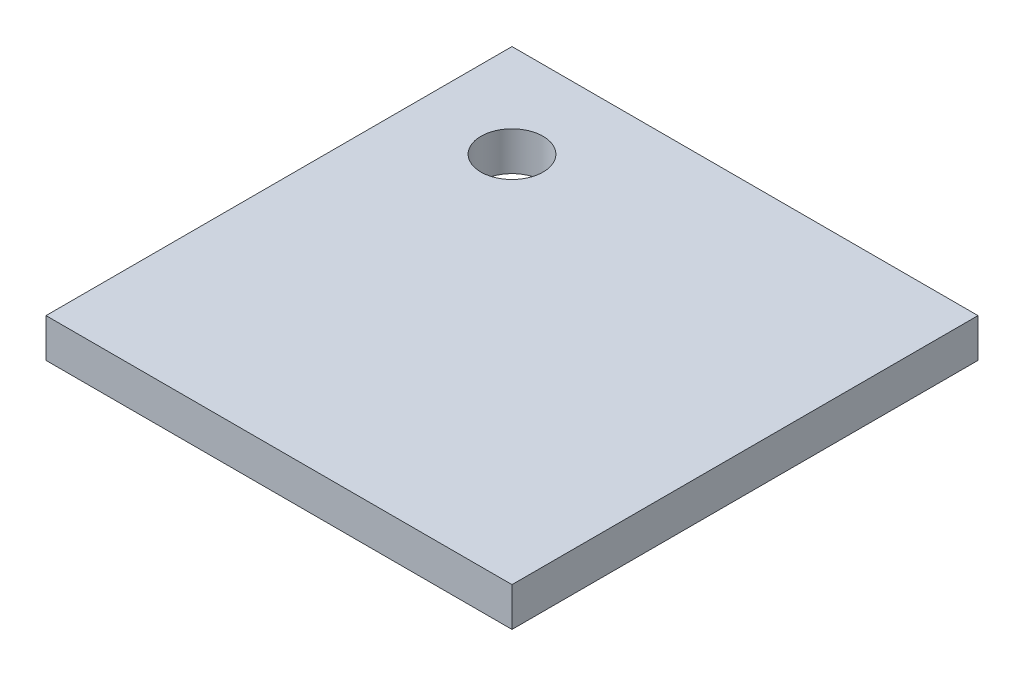
ISO-10303-21;
HEADER;
FILE_DESCRIPTION(('STEP AP214'),'2;1');
FILE_NAME('part.step','',(''),(''),'','','');
FILE_SCHEMA(('AUTOMOTIVE_DESIGN { 1 0 10303 214 1 1 1 1 }'));
ENDSEC;
DATA;
#1=APPLICATION_CONTEXT('core data for automotive mechanical design processes');
#2=APPLICATION_PROTOCOL_DEFINITION('international standard','automotive_design',2000,#1);
#3=PRODUCT_CONTEXT('',#1,'mechanical');
#4=PRODUCT('Part','Part','',(#3));
#5=PRODUCT_RELATED_PRODUCT_CATEGORY('part','',(#4));
#6=PRODUCT_DEFINITION_FORMATION('','',#4);
#7=PRODUCT_DEFINITION_CONTEXT('part definition',#1,'design');
#8=PRODUCT_DEFINITION('design','',#6,#7);
#9=PRODUCT_DEFINITION_SHAPE('','',#8);
#10=(LENGTH_UNIT() NAMED_UNIT(*) SI_UNIT(.MILLI.,.METRE.));
#11=(NAMED_UNIT(*) PLANE_ANGLE_UNIT() SI_UNIT($,.RADIAN.));
#12=(NAMED_UNIT(*) SI_UNIT($,.STERADIAN.) SOLID_ANGLE_UNIT());
#13=UNCERTAINTY_MEASURE_WITH_UNIT(LENGTH_MEASURE(1.E-05),#10,'distance_accuracy_value','');
#14=(GEOMETRIC_REPRESENTATION_CONTEXT(3) GLOBAL_UNCERTAINTY_ASSIGNED_CONTEXT((#13)) GLOBAL_UNIT_ASSIGNED_CONTEXT((#10,
#11,#12)) REPRESENTATION_CONTEXT('',''));
#15=CARTESIAN_POINT('',(0.,0.,0.));
#16=DIRECTION('',(0.,0.,1.));
#17=DIRECTION('',(1.,0.,0.));
#18=AXIS2_PLACEMENT_3D('',#15,#16,#17);
#19=CARTESIAN_POINT('',(0.,5.,0.));
#20=DIRECTION('',(0.,1.,0.));
#21=DIRECTION('',(0.,0.,1.));
#22=AXIS2_PLACEMENT_3D('',#19,#20,#21);
#23=PLANE('',#22);
#24=DIRECTION('',(0.,0.,1.));
#25=VECTOR('',#24,1.);
#26=CARTESIAN_POINT('',(0.,5.,0.));
#27=LINE('',#26,#25);
#28=CARTESIAN_POINT('',(0.,5.,0.));
#29=VERTEX_POINT('',#28);
#30=CARTESIAN_POINT('',(0.,5.,60.));
#31=VERTEX_POINT('',#30);
#32=EDGE_CURVE('E85',#29,#31,#27,.T.);
#33=ORIENTED_EDGE('',*,*,#32,.T.);
#34=DIRECTION('',(1.,0.,0.));
#35=VECTOR('',#34,1.);
#36=CARTESIAN_POINT('',(0.,5.,60.));
#37=LINE('',#36,#35);
#38=CARTESIAN_POINT('',(60.,5.,60.));
#39=VERTEX_POINT('',#38);
#40=EDGE_CURVE('E80',#31,#39,#37,.T.);
#41=ORIENTED_EDGE('',*,*,#40,.T.);
#42=DIRECTION('',(0.,0.,-1.));
#43=VECTOR('',#42,1.);
#44=CARTESIAN_POINT('',(60.,5.,0.));
#45=LINE('',#44,#43);
#46=CARTESIAN_POINT('',(60.,5.,0.));
#47=VERTEX_POINT('',#46);
#48=EDGE_CURVE('E83',#39,#47,#45,.T.);
#49=ORIENTED_EDGE('',*,*,#48,.T.);
#50=DIRECTION('',(-1.,0.,0.));
#51=VECTOR('',#50,1.);
#52=CARTESIAN_POINT('',(0.,5.,0.));
#53=LINE('',#52,#51);
#54=EDGE_CURVE('E50',#47,#29,#53,.T.);
#55=ORIENTED_EDGE('',*,*,#54,.T.);
#56=EDGE_LOOP('',(#33,#41,#49,#55));
#57=FACE_BOUND('',#56,.T.);
#58=CARTESIAN_POINT('',(12.,5.,12.));
#59=DIRECTION('',(0.,1.,0.));
#60=DIRECTION('',(0.,0.,1.));
#61=AXIS2_PLACEMENT_3D('',#58,#59,#60);
#62=CIRCLE('',#61,4.);
#63=CARTESIAN_POINT('',(12.,5.,16.));
#64=VERTEX_POINT('',#63);
#65=EDGE_CURVE('E100',#64,#64,#62,.T.);
#66=ORIENTED_EDGE('',*,*,#65,.F.);
#67=EDGE_LOOP('',(#66));
#68=FACE_BOUND('',#67,.T.);
#69=ADVANCED_FACE('F33',(#57,#68),#23,.T.);
#70=CARTESIAN_POINT('',(0.,0.,0.));
#71=DIRECTION('',(0.,1.,0.));
#72=DIRECTION('',(0.,0.,1.));
#73=AXIS2_PLACEMENT_3D('',#70,#71,#72);
#74=PLANE('',#73);
#75=DIRECTION('',(0.,0.,1.));
#76=VECTOR('',#75,1.);
#77=CARTESIAN_POINT('',(0.,0.,0.));
#78=LINE('',#77,#76);
#79=CARTESIAN_POINT('',(0.,0.,0.));
#80=VERTEX_POINT('',#79);
#81=CARTESIAN_POINT('',(0.,0.,60.));
#82=VERTEX_POINT('',#81);
#83=EDGE_CURVE('E97',#80,#82,#78,.T.);
#84=ORIENTED_EDGE('',*,*,#83,.F.);
#85=DIRECTION('',(-1.,0.,0.));
#86=VECTOR('',#85,1.);
#87=CARTESIAN_POINT('',(0.,0.,0.));
#88=LINE('',#87,#86);
#89=CARTESIAN_POINT('',(60.,0.,0.));
#90=VERTEX_POINT('',#89);
#91=EDGE_CURVE('E73',#90,#80,#88,.T.);
#92=ORIENTED_EDGE('',*,*,#91,.F.);
#93=DIRECTION('',(0.,0.,-1.));
#94=VECTOR('',#93,1.);
#95=CARTESIAN_POINT('',(60.,0.,0.));
#96=LINE('',#95,#94);
#97=CARTESIAN_POINT('',(60.,0.,60.));
#98=VERTEX_POINT('',#97);
#99=EDGE_CURVE('E67',#98,#90,#96,.T.);
#100=ORIENTED_EDGE('',*,*,#99,.F.);
#101=DIRECTION('',(1.,0.,0.));
#102=VECTOR('',#101,1.);
#103=CARTESIAN_POINT('',(0.,0.,60.));
#104=LINE('',#103,#102);
#105=EDGE_CURVE('E89',#82,#98,#104,.T.);
#106=ORIENTED_EDGE('',*,*,#105,.F.);
#107=EDGE_LOOP('',(#84,#92,#100,#106));
#108=FACE_BOUND('',#107,.T.);
#109=CARTESIAN_POINT('',(12.,0.,12.));
#110=DIRECTION('',(0.,1.,0.));
#111=DIRECTION('',(0.,0.,1.));
#112=AXIS2_PLACEMENT_3D('',#109,#110,#111);
#113=CIRCLE('',#112,4.);
#114=CARTESIAN_POINT('',(12.,0.,16.));
#115=VERTEX_POINT('',#114);
#116=EDGE_CURVE('E112',#115,#115,#113,.T.);
#117=ORIENTED_EDGE('',*,*,#116,.T.);
#118=EDGE_LOOP('',(#117));
#119=FACE_BOUND('',#118,.T.);
#120=ADVANCED_FACE('F108',(#108,#119),#74,.F.);
#121=CARTESIAN_POINT('',(0.,5.,0.));
#122=DIRECTION('',(1.,0.,0.));
#123=DIRECTION('',(0.,0.,-1.));
#124=AXIS2_PLACEMENT_3D('',#121,#122,#123);
#125=PLANE('',#124);
#126=ORIENTED_EDGE('',*,*,#83,.T.);
#127=DIRECTION('',(0.,-1.,0.));
#128=VECTOR('',#127,1.);
#129=CARTESIAN_POINT('',(0.,5.,60.));
#130=LINE('',#129,#128);
#131=EDGE_CURVE('E11',#31,#82,#130,.T.);
#132=ORIENTED_EDGE('',*,*,#131,.F.);
#133=ORIENTED_EDGE('',*,*,#32,.F.);
#134=DIRECTION('',(0.,-1.,0.));
#135=VECTOR('',#134,1.);
#136=CARTESIAN_POINT('',(0.,5.,0.));
#137=LINE('',#136,#135);
#138=EDGE_CURVE('E93',#29,#80,#137,.T.);
#139=ORIENTED_EDGE('',*,*,#138,.T.);
#140=EDGE_LOOP('',(#126,#132,#133,#139));
#141=FACE_BOUND('',#140,.T.);
#142=ADVANCED_FACE('F35',(#141),#125,.F.);
#143=CARTESIAN_POINT('',(0.,5.,60.));
#144=DIRECTION('',(0.,0.,-1.));
#145=DIRECTION('',(-1.,0.,0.));
#146=AXIS2_PLACEMENT_3D('',#143,#144,#145);
#147=PLANE('',#146);
#148=ORIENTED_EDGE('',*,*,#105,.T.);
#149=DIRECTION('',(0.,-1.,0.));
#150=VECTOR('',#149,1.);
#151=CARTESIAN_POINT('',(60.,5.,60.));
#152=LINE('',#151,#150);
#153=EDGE_CURVE('E42',#39,#98,#152,.T.);
#154=ORIENTED_EDGE('',*,*,#153,.F.);
#155=ORIENTED_EDGE('',*,*,#40,.F.);
#156=ORIENTED_EDGE('',*,*,#131,.T.);
#157=EDGE_LOOP('',(#148,#154,#155,#156));
#158=FACE_BOUND('',#157,.T.);
#159=ADVANCED_FACE('F88',(#158),#147,.F.);
#160=CARTESIAN_POINT('',(60.,5.,0.));
#161=DIRECTION('',(-1.,0.,0.));
#162=DIRECTION('',(0.,0.,1.));
#163=AXIS2_PLACEMENT_3D('',#160,#161,#162);
#164=PLANE('',#163);
#165=ORIENTED_EDGE('',*,*,#99,.T.);
#166=DIRECTION('',(0.,-1.,0.));
#167=VECTOR('',#166,1.);
#168=CARTESIAN_POINT('',(60.,5.,0.));
#169=LINE('',#168,#167);
#170=EDGE_CURVE('E90',#47,#90,#169,.T.);
#171=ORIENTED_EDGE('',*,*,#170,.F.);
#172=ORIENTED_EDGE('',*,*,#48,.F.);
#173=ORIENTED_EDGE('',*,*,#153,.T.);
#174=EDGE_LOOP('',(#165,#171,#172,#173));
#175=FACE_BOUND('',#174,.T.);
#176=ADVANCED_FACE('F91',(#175),#164,.F.);
#177=CARTESIAN_POINT('',(0.,5.,0.));
#178=DIRECTION('',(0.,0.,1.));
#179=DIRECTION('',(1.,0.,0.));
#180=AXIS2_PLACEMENT_3D('',#177,#178,#179);
#181=PLANE('',#180);
#182=ORIENTED_EDGE('',*,*,#91,.T.);
#183=ORIENTED_EDGE('',*,*,#138,.F.);
#184=ORIENTED_EDGE('',*,*,#54,.F.);
#185=ORIENTED_EDGE('',*,*,#170,.T.);
#186=EDGE_LOOP('',(#182,#183,#184,#185));
#187=FACE_BOUND('',#186,.T.);
#188=ADVANCED_FACE('F105',(#187),#181,.F.);
#189=CARTESIAN_POINT('',(12.,5.,12.));
#190=DIRECTION('',(0.,-1.,0.));
#191=DIRECTION('',(0.,0.,-1.));
#192=AXIS2_PLACEMENT_3D('',#189,#190,#191);
#193=CYLINDRICAL_SURFACE('',#192,4.);
#194=ORIENTED_EDGE('',*,*,#65,.T.);
#195=EDGE_LOOP('',(#194));
#196=FACE_BOUND('',#195,.T.);
#197=ORIENTED_EDGE('',*,*,#116,.F.);
#198=EDGE_LOOP('',(#197));
#199=FACE_BOUND('',#198,.T.);
#200=ADVANCED_FACE('F118',(#196,#199),#193,.F.);
#201=CLOSED_SHELL('',(#69,#120,#142,#159,#176,#188,#200));
#202=MANIFOLD_SOLID_BREP('B2',#201);
#203=ADVANCED_BREP_SHAPE_REPRESENTATION('',(#18,#202),#14);
#204=SHAPE_DEFINITION_REPRESENTATION(#9,#203);
ENDSEC;
END-ISO-10303-21;
